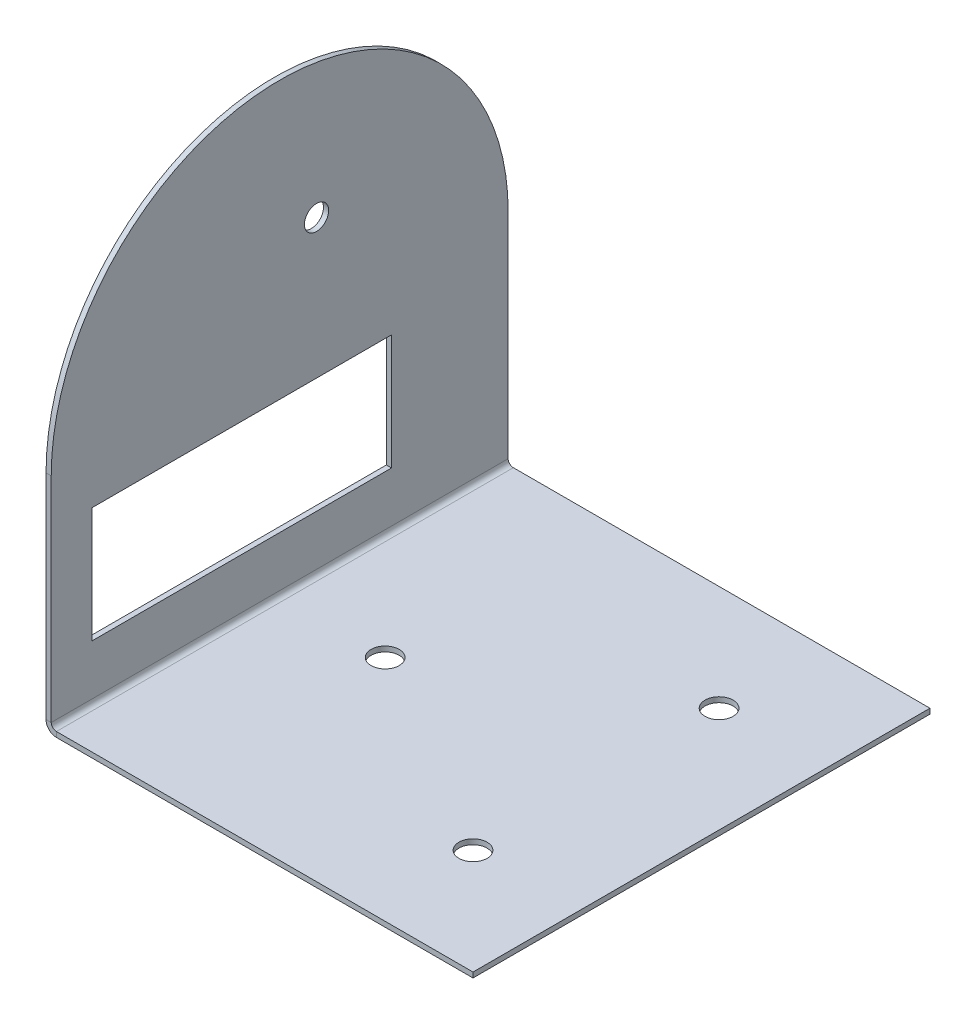
ISO-10303-21;
HEADER;
FILE_DESCRIPTION(('STEP AP214'),'2;1');
FILE_NAME('part.step','',(''),(''),'','','');
FILE_SCHEMA(('AUTOMOTIVE_DESIGN { 1 0 10303 214 1 1 1 1 }'));
ENDSEC;
DATA;
#1=APPLICATION_CONTEXT('core data for automotive mechanical design processes');
#2=APPLICATION_PROTOCOL_DEFINITION('international standard','automotive_design',2000,#1);
#3=PRODUCT_CONTEXT('',#1,'mechanical');
#4=PRODUCT('Part','Part','',(#3));
#5=PRODUCT_RELATED_PRODUCT_CATEGORY('part','',(#4));
#6=PRODUCT_DEFINITION_FORMATION('','',#4);
#7=PRODUCT_DEFINITION_CONTEXT('part definition',#1,'design');
#8=PRODUCT_DEFINITION('design','',#6,#7);
#9=PRODUCT_DEFINITION_SHAPE('','',#8);
#10=(LENGTH_UNIT() NAMED_UNIT(*) SI_UNIT(.MILLI.,.METRE.));
#11=(NAMED_UNIT(*) PLANE_ANGLE_UNIT() SI_UNIT($,.RADIAN.));
#12=(NAMED_UNIT(*) SI_UNIT($,.STERADIAN.) SOLID_ANGLE_UNIT());
#13=UNCERTAINTY_MEASURE_WITH_UNIT(LENGTH_MEASURE(1.E-05),#10,'distance_accuracy_value','');
#14=(GEOMETRIC_REPRESENTATION_CONTEXT(3) GLOBAL_UNCERTAINTY_ASSIGNED_CONTEXT((#13)) GLOBAL_UNIT_ASSIGNED_CONTEXT((#10,
#11,#12)) REPRESENTATION_CONTEXT('',''));
#15=CARTESIAN_POINT('',(0.,0.,0.));
#16=DIRECTION('',(0.,0.,1.));
#17=DIRECTION('',(1.,0.,0.));
#18=AXIS2_PLACEMENT_3D('',#15,#16,#17);
#19=CARTESIAN_POINT('',(-0.0424794644886288,31.1258682095468,32.5));
#20=DIRECTION('',(0.,0.,1.));
#21=DIRECTION('',(0.,-1.,0.));
#22=AXIS2_PLACEMENT_3D('',#19,#20,#21);
#23=PLANE('',#22);
#24=DIRECTION('',(0.,-1.,0.));
#25=VECTOR('',#24,1.);
#26=CARTESIAN_POINT('',(-0.0424794644886288,31.1258682095468,32.5));
#27=LINE('',#26,#25);
#28=CARTESIAN_POINT('',(-0.0424794644886288,31.1258682095468,32.5));
#29=VERTEX_POINT('',#28);
#30=CARTESIAN_POINT('',(-0.0424794644887348,0.736600000000005,32.5));
#31=VERTEX_POINT('',#30);
#32=EDGE_CURVE('E216',#29,#31,#27,.T.);
#33=ORIENTED_EDGE('',*,*,#32,.T.);
#34=DIRECTION('',(1.,0.,0.));
#35=VECTOR('',#34,1.);
#36=CARTESIAN_POINT('',(-0.0424794644887348,0.736600000000005,32.5));
#37=LINE('',#36,#35);
#38=CARTESIAN_POINT('',(0.694120535511267,0.736600000000006,32.5));
#39=VERTEX_POINT('',#38);
#40=EDGE_CURVE('E235',#31,#39,#37,.T.);
#41=ORIENTED_EDGE('',*,*,#40,.T.);
#42=DIRECTION('',(0.,-1.,0.));
#43=VECTOR('',#42,1.);
#44=CARTESIAN_POINT('',(0.694120535511371,31.1258682095468,32.5));
#45=LINE('',#44,#43);
#46=CARTESIAN_POINT('',(0.694120535511371,31.1258682095468,32.5));
#47=VERTEX_POINT('',#46);
#48=EDGE_CURVE('E221',#47,#39,#45,.T.);
#49=ORIENTED_EDGE('',*,*,#48,.F.);
#50=DIRECTION('',(1.,0.,0.));
#51=VECTOR('',#50,1.);
#52=CARTESIAN_POINT('',(-0.0424794644886288,31.1258682095468,32.5));
#53=LINE('',#52,#51);
#54=EDGE_CURVE('E222',#29,#47,#53,.T.);
#55=ORIENTED_EDGE('',*,*,#54,.F.);
#56=EDGE_LOOP('',(#33,#41,#49,#55));
#57=FACE_BOUND('',#56,.T.);
#58=ADVANCED_FACE('F41',(#57),#23,.T.);
#59=CARTESIAN_POINT('',(-0.0424794644886357,31.1258682095468,-32.5));
#60=DIRECTION('',(0.,0.,-1.));
#61=DIRECTION('',(0.,1.,0.));
#62=AXIS2_PLACEMENT_3D('',#59,#60,#61);
#63=PLANE('',#62);
#64=DIRECTION('',(0.,1.,0.));
#65=VECTOR('',#64,1.);
#66=CARTESIAN_POINT('',(0.694120535511364,31.1258682095468,-32.5));
#67=LINE('',#66,#65);
#68=CARTESIAN_POINT('',(0.69412053551126,0.736600000000006,-32.5));
#69=VERTEX_POINT('',#68);
#70=CARTESIAN_POINT('',(0.694120535511364,31.1258682095468,-32.5));
#71=VERTEX_POINT('',#70);
#72=EDGE_CURVE('E140',#69,#71,#67,.T.);
#73=ORIENTED_EDGE('',*,*,#72,.F.);
#74=DIRECTION('',(-1.,0.,0.));
#75=VECTOR('',#74,1.);
#76=CARTESIAN_POINT('',(-0.0424794644887417,0.736600000000005,-32.5));
#77=LINE('',#76,#75);
#78=CARTESIAN_POINT('',(-0.04247946448874,0.736600000000013,-32.5));
#79=VERTEX_POINT('',#78);
#80=EDGE_CURVE('E230',#69,#79,#77,.T.);
#81=ORIENTED_EDGE('',*,*,#80,.T.);
#82=DIRECTION('',(0.,1.,0.));
#83=VECTOR('',#82,1.);
#84=CARTESIAN_POINT('',(-0.0424794644886357,31.1258682095468,-32.5));
#85=LINE('',#84,#83);
#86=CARTESIAN_POINT('',(-0.0424794644886357,31.1258682095468,-32.5));
#87=VERTEX_POINT('',#86);
#88=EDGE_CURVE('E217',#79,#87,#85,.T.);
#89=ORIENTED_EDGE('',*,*,#88,.T.);
#90=DIRECTION('',(1.,0.,0.));
#91=VECTOR('',#90,1.);
#92=CARTESIAN_POINT('',(-0.0424794644886357,31.1258682095468,-32.5));
#93=LINE('',#92,#91);
#94=EDGE_CURVE('E225',#87,#71,#93,.T.);
#95=ORIENTED_EDGE('',*,*,#94,.T.);
#96=EDGE_LOOP('',(#73,#81,#89,#95));
#97=FACE_BOUND('',#96,.T.);
#98=ADVANCED_FACE('F283',(#97),#63,.T.);
#99=CARTESIAN_POINT('',(-0.0424794644886322,31.1258682095468,0.));
#100=DIRECTION('',(-1.,0.,0.));
#101=DIRECTION('',(0.,0.,-1.));
#102=AXIS2_PLACEMENT_3D('',#99,#100,#101);
#103=PLANE('',#102);
#104=CARTESIAN_POINT('',(-0.042479464488588,44.0838038982933,-5.23936924556023));
#105=DIRECTION('',(-1.,0.,0.));
#106=DIRECTION('',(0.,-1.,0.));
#107=AXIS2_PLACEMENT_3D('',#104,#105,#106);
#108=CIRCLE('',#107,1.7249999999959);
#109=CARTESIAN_POINT('',(-0.042479464488594,42.3588038982974,-5.23936924556023));
#110=VERTEX_POINT('',#109);
#111=EDGE_CURVE('E164',#110,#110,#108,.T.);
#112=ORIENTED_EDGE('',*,*,#111,.F.);
#113=EDGE_LOOP('',(#112));
#114=FACE_BOUND('',#113,.T.);
#115=DIRECTION('',(0.,0.,-1.));
#116=VECTOR('',#115,1.);
#117=CARTESIAN_POINT('',(-0.0424794644886561,24.2941252983151,0.));
#118=LINE('',#117,#116);
#119=CARTESIAN_POINT('',(-0.0424794644886817,24.2941252983151,26.667867805827));
#120=VERTEX_POINT('',#119);
#121=CARTESIAN_POINT('',(-0.0424794644886578,24.2941252983152,-15.904978209786));
#122=VERTEX_POINT('',#121);
#123=EDGE_CURVE('E181',#120,#122,#118,.T.);
#124=ORIENTED_EDGE('',*,*,#123,.F.);
#125=DIRECTION('',(0.,1.,0.));
#126=VECTOR('',#125,1.);
#127=CARTESIAN_POINT('',(-0.0424794644886294,31.1258682095468,26.667867805827));
#128=LINE('',#127,#126);
#129=CARTESIAN_POINT('',(-0.0424794644887129,7.89147844340477,26.667867805827));
#130=VERTEX_POINT('',#129);
#131=EDGE_CURVE('E179',#130,#120,#128,.T.);
#132=ORIENTED_EDGE('',*,*,#131,.F.);
#133=DIRECTION('',(0.,0.,1.));
#134=VECTOR('',#133,1.);
#135=CARTESIAN_POINT('',(-0.0424794644887134,7.89147844340476,0.));
#136=LINE('',#135,#134);
#137=CARTESIAN_POINT('',(-0.0424794644886851,7.89147844340476,-15.904978209786));
#138=VERTEX_POINT('',#137);
#139=EDGE_CURVE('E177',#138,#130,#136,.T.);
#140=ORIENTED_EDGE('',*,*,#139,.F.);
#141=DIRECTION('',(0.,-1.,0.));
#142=VECTOR('',#141,1.);
#143=CARTESIAN_POINT('',(-0.0424794644886339,31.1258682095468,-15.904978209786));
#144=LINE('',#143,#142);
#145=EDGE_CURVE('E170',#122,#138,#144,.T.);
#146=ORIENTED_EDGE('',*,*,#145,.F.);
#147=EDGE_LOOP('',(#124,#132,#140,#146));
#148=FACE_BOUND('',#147,.T.);
#149=ORIENTED_EDGE('',*,*,#88,.F.);
#150=DIRECTION('',(0.,0.,1.));
#151=VECTOR('',#150,1.);
#152=CARTESIAN_POINT('',(-0.0424794644887383,0.736600000000005,0.));
#153=LINE('',#152,#151);
#154=EDGE_CURVE('E224',#79,#31,#153,.T.);
#155=ORIENTED_EDGE('',*,*,#154,.T.);
#156=ORIENTED_EDGE('',*,*,#32,.F.);
#157=CARTESIAN_POINT('',(-0.0424794644886322,31.1258682095468,0.));
#158=DIRECTION('',(1.,0.,0.));
#159=DIRECTION('',(0.,0.,-1.));
#160=AXIS2_PLACEMENT_3D('',#157,#158,#159);
#161=CIRCLE('',#160,32.5);
#162=EDGE_CURVE('E213',#87,#29,#161,.T.);
#163=ORIENTED_EDGE('',*,*,#162,.F.);
#164=EDGE_LOOP('',(#149,#155,#156,#163));
#165=FACE_BOUND('',#164,.T.);
#166=ADVANCED_FACE('F265',(#114,#148,#165),#103,.T.);
#167=CARTESIAN_POINT('',(-0.0424794644886322,31.1258682095468,0.));
#168=DIRECTION('',(1.,0.,0.));
#169=DIRECTION('',(0.,0.,1.));
#170=AXIS2_PLACEMENT_3D('',#167,#168,#169);
#171=CYLINDRICAL_SURFACE('',#170,32.5);
#172=CARTESIAN_POINT('',(0.694120535511368,31.1258682095468,0.));
#173=DIRECTION('',(1.,0.,0.));
#174=DIRECTION('',(0.,0.,-1.));
#175=AXIS2_PLACEMENT_3D('',#172,#173,#174);
#176=CIRCLE('',#175,32.5);
#177=EDGE_CURVE('E218',#71,#47,#176,.T.);
#178=ORIENTED_EDGE('',*,*,#177,.F.);
#179=ORIENTED_EDGE('',*,*,#94,.F.);
#180=ORIENTED_EDGE('',*,*,#162,.T.);
#181=ORIENTED_EDGE('',*,*,#54,.T.);
#182=EDGE_LOOP('',(#178,#179,#180,#181));
#183=FACE_BOUND('',#182,.T.);
#184=ADVANCED_FACE('F316',(#183),#171,.T.);
#185=CARTESIAN_POINT('',(0.694120535511368,31.1258682095468,0.));
#186=DIRECTION('',(-1.,0.,0.));
#187=DIRECTION('',(0.,0.,-1.));
#188=AXIS2_PLACEMENT_3D('',#185,#186,#187);
#189=PLANE('',#188);
#190=CARTESIAN_POINT('',(0.694120535511412,44.0838038982933,-5.23936924556023));
#191=DIRECTION('',(-1.,0.,0.));
#192=DIRECTION('',(0.,-1.,0.));
#193=AXIS2_PLACEMENT_3D('',#190,#191,#192);
#194=CIRCLE('',#193,1.7249999999959);
#195=CARTESIAN_POINT('',(0.694120535511406,42.3588038982974,-5.23936924556023));
#196=VERTEX_POINT('',#195);
#197=EDGE_CURVE('E44',#196,#196,#194,.T.);
#198=ORIENTED_EDGE('',*,*,#197,.T.);
#199=EDGE_LOOP('',(#198));
#200=FACE_BOUND('',#199,.T.);
#201=DIRECTION('',(0.,1.,0.));
#202=VECTOR('',#201,1.);
#203=CARTESIAN_POINT('',(0.694120535511371,31.1258682095468,26.667867805827));
#204=LINE('',#203,#202);
#205=CARTESIAN_POINT('',(0.694120535511288,7.89147844340477,26.667867805827));
#206=VERTEX_POINT('',#205);
#207=CARTESIAN_POINT('',(0.694120535511319,24.2941252983151,26.667867805827));
#208=VERTEX_POINT('',#207);
#209=EDGE_CURVE('E49',#206,#208,#204,.T.);
#210=ORIENTED_EDGE('',*,*,#209,.T.);
#211=DIRECTION('',(0.,0.,-1.));
#212=VECTOR('',#211,1.);
#213=CARTESIAN_POINT('',(0.694120535511344,24.2941252983151,0.));
#214=LINE('',#213,#212);
#215=CARTESIAN_POINT('',(0.694120535511315,24.2941252983151,-15.904978209786));
#216=VERTEX_POINT('',#215);
#217=EDGE_CURVE('E12',#208,#216,#214,.T.);
#218=ORIENTED_EDGE('',*,*,#217,.T.);
#219=DIRECTION('',(0.,-1.,0.));
#220=VECTOR('',#219,1.);
#221=CARTESIAN_POINT('',(0.694120535511366,31.1258682095468,-15.904978209786));
#222=LINE('',#221,#220);
#223=CARTESIAN_POINT('',(0.694120535511285,7.89147844340473,-15.904978209786));
#224=VERTEX_POINT('',#223);
#225=EDGE_CURVE('E238',#216,#224,#222,.T.);
#226=ORIENTED_EDGE('',*,*,#225,.T.);
#227=DIRECTION('',(0.,0.,1.));
#228=VECTOR('',#227,1.);
#229=CARTESIAN_POINT('',(0.694120535511287,7.89147844340476,0.));
#230=LINE('',#229,#228);
#231=EDGE_CURVE('E247',#224,#206,#230,.T.);
#232=ORIENTED_EDGE('',*,*,#231,.T.);
#233=EDGE_LOOP('',(#210,#218,#226,#232));
#234=FACE_BOUND('',#233,.T.);
#235=DIRECTION('',(0.,0.,1.));
#236=VECTOR('',#235,1.);
#237=CARTESIAN_POINT('',(0.694120535511262,0.736600000000003,0.));
#238=LINE('',#237,#236);
#239=EDGE_CURVE('E233',#69,#39,#238,.T.);
#240=ORIENTED_EDGE('',*,*,#239,.F.);
#241=ORIENTED_EDGE('',*,*,#72,.T.);
#242=ORIENTED_EDGE('',*,*,#177,.T.);
#243=ORIENTED_EDGE('',*,*,#48,.T.);
#244=EDGE_LOOP('',(#240,#241,#242,#243));
#245=FACE_BOUND('',#244,.T.);
#246=ADVANCED_FACE('F252',(#200,#234,#245),#189,.F.);
#247=CARTESIAN_POINT('',(15.6941205355112,-0.7366,0.));
#248=DIRECTION('',(0.,1.,0.));
#249=DIRECTION('',(0.,0.,1.));
#250=AXIS2_PLACEMENT_3D('',#247,#248,#249);
#251=CYLINDRICAL_SURFACE('',#250,2.);
#252=CARTESIAN_POINT('',(15.6941205355112,-0.7366,0.));
#253=DIRECTION('',(0.,1.,0.));
#254=DIRECTION('',(0.,0.,1.));
#255=AXIS2_PLACEMENT_3D('',#252,#253,#254);
#256=CIRCLE('',#255,2.);
#257=CARTESIAN_POINT('',(15.6941205355112,-0.7366,2.));
#258=VERTEX_POINT('',#257);
#259=EDGE_CURVE('E202',#258,#258,#256,.T.);
#260=ORIENTED_EDGE('',*,*,#259,.F.);
#261=EDGE_LOOP('',(#260));
#262=FACE_BOUND('',#261,.T.);
#263=CARTESIAN_POINT('',(15.6941205355112,0.,0.));
#264=DIRECTION('',(0.,1.,0.));
#265=DIRECTION('',(0.,0.,1.));
#266=AXIS2_PLACEMENT_3D('',#263,#264,#265);
#267=CIRCLE('',#266,2.);
#268=CARTESIAN_POINT('',(15.6941205355112,0.,2.));
#269=VERTEX_POINT('',#268);
#270=EDGE_CURVE('E205',#269,#269,#267,.T.);
#271=ORIENTED_EDGE('',*,*,#270,.T.);
#272=EDGE_LOOP('',(#271));
#273=FACE_BOUND('',#272,.T.);
#274=ADVANCED_FACE('F323',(#262,#273),#251,.F.);
#275=CARTESIAN_POINT('',(-30.6941205355112,-0.7366,0.));
#276=DIRECTION('',(0.,-1.,0.));
#277=DIRECTION('',(0.,0.,-1.));
#278=AXIS2_PLACEMENT_3D('',#275,#276,#277);
#279=PLANE('',#278);
#280=DIRECTION('',(0.,0.,1.));
#281=VECTOR('',#280,1.);
#282=CARTESIAN_POINT('',(1.43072053551126,-0.7366,0.));
#283=LINE('',#282,#281);
#284=CARTESIAN_POINT('',(1.43072053551126,-0.7366,-32.5));
#285=VERTEX_POINT('',#284);
#286=CARTESIAN_POINT('',(1.43072053551126,-0.7366,32.5));
#287=VERTEX_POINT('',#286);
#288=EDGE_CURVE('E190',#285,#287,#283,.T.);
#289=ORIENTED_EDGE('',*,*,#288,.F.);
#290=DIRECTION('',(-1.,0.,0.));
#291=VECTOR('',#290,1.);
#292=CARTESIAN_POINT('',(-30.6941205355112,-0.7366,-32.5));
#293=LINE('',#292,#291);
#294=CARTESIAN_POINT('',(60.6941205355112,-0.7366,-32.5));
#295=VERTEX_POINT('',#294);
#296=EDGE_CURVE('E154',#295,#285,#293,.T.);
#297=ORIENTED_EDGE('',*,*,#296,.F.);
#298=DIRECTION('',(0.,0.,-1.));
#299=VECTOR('',#298,1.);
#300=CARTESIAN_POINT('',(60.6941205355112,-0.7366,32.5));
#301=LINE('',#300,#299);
#302=CARTESIAN_POINT('',(60.6941205355112,-0.7366,32.5));
#303=VERTEX_POINT('',#302);
#304=EDGE_CURVE('E147',#303,#295,#301,.T.);
#305=ORIENTED_EDGE('',*,*,#304,.F.);
#306=DIRECTION('',(1.,0.,0.));
#307=VECTOR('',#306,1.);
#308=CARTESIAN_POINT('',(-30.6941205355112,-0.7366,32.5));
#309=LINE('',#308,#307);
#310=EDGE_CURVE('E129',#287,#303,#309,.T.);
#311=ORIENTED_EDGE('',*,*,#310,.F.);
#312=EDGE_LOOP('',(#289,#297,#305,#311));
#313=FACE_BOUND('',#312,.T.);
#314=ORIENTED_EDGE('',*,*,#259,.T.);
#315=EDGE_LOOP('',(#314));
#316=FACE_BOUND('',#315,.T.);
#317=CARTESIAN_POINT('',(45.6941205355112,-0.7366,-17.5));
#318=DIRECTION('',(0.,1.,0.));
#319=DIRECTION('',(0.,0.,1.));
#320=AXIS2_PLACEMENT_3D('',#317,#318,#319);
#321=CIRCLE('',#320,2.);
#322=CARTESIAN_POINT('',(45.6941205355112,-0.7366,-15.5));
#323=VERTEX_POINT('',#322);
#324=EDGE_CURVE('E537',#323,#323,#321,.T.);
#325=ORIENTED_EDGE('',*,*,#324,.T.);
#326=EDGE_LOOP('',(#325));
#327=FACE_BOUND('',#326,.T.);
#328=CARTESIAN_POINT('',(45.6941205355112,-0.7366,17.5));
#329=DIRECTION('',(0.,1.,0.));
#330=DIRECTION('',(0.,0.,1.));
#331=AXIS2_PLACEMENT_3D('',#328,#329,#330);
#332=CIRCLE('',#331,2.);
#333=CARTESIAN_POINT('',(45.6941205355112,-0.7366,19.5));
#334=VERTEX_POINT('',#333);
#335=EDGE_CURVE('E157',#334,#334,#332,.T.);
#336=ORIENTED_EDGE('',*,*,#335,.T.);
#337=EDGE_LOOP('',(#336));
#338=FACE_BOUND('',#337,.T.);
#339=ADVANCED_FACE('F152',(#313,#316,#327,#338),#279,.T.);
#340=CARTESIAN_POINT('',(-30.6941205355112,-0.7366,-32.5));
#341=DIRECTION('',(0.,0.,-1.));
#342=DIRECTION('',(-1.,0.,0.));
#343=AXIS2_PLACEMENT_3D('',#340,#341,#342);
#344=PLANE('',#343);
#345=DIRECTION('',(0.,-1.,0.));
#346=VECTOR('',#345,1.);
#347=CARTESIAN_POINT('',(1.43072053551126,-0.7366,-32.5));
#348=LINE('',#347,#346);
#349=CARTESIAN_POINT('',(1.43072053551126,0.,-32.5));
#350=VERTEX_POINT('',#349);
#351=EDGE_CURVE('E208',#350,#285,#348,.T.);
#352=ORIENTED_EDGE('',*,*,#351,.F.);
#353=DIRECTION('',(-1.,0.,0.));
#354=VECTOR('',#353,1.);
#355=CARTESIAN_POINT('',(-30.6941205355112,0.,-32.5));
#356=LINE('',#355,#354);
#357=CARTESIAN_POINT('',(60.6941205355112,0.,-32.5));
#358=VERTEX_POINT('',#357);
#359=EDGE_CURVE('E199',#358,#350,#356,.T.);
#360=ORIENTED_EDGE('',*,*,#359,.F.);
#361=DIRECTION('',(0.,1.,0.));
#362=VECTOR('',#361,1.);
#363=CARTESIAN_POINT('',(60.6941205355112,-0.7366,-32.5));
#364=LINE('',#363,#362);
#365=EDGE_CURVE('E150',#295,#358,#364,.T.);
#366=ORIENTED_EDGE('',*,*,#365,.F.);
#367=ORIENTED_EDGE('',*,*,#296,.T.);
#368=EDGE_LOOP('',(#352,#360,#366,#367));
#369=FACE_BOUND('',#368,.T.);
#370=ADVANCED_FACE('F304',(#369),#344,.T.);
#371=CARTESIAN_POINT('',(-30.6941205355112,0.,0.));
#372=DIRECTION('',(0.,-1.,0.));
#373=DIRECTION('',(0.,0.,-1.));
#374=AXIS2_PLACEMENT_3D('',#371,#372,#373);
#375=PLANE('',#374);
#376=ORIENTED_EDGE('',*,*,#270,.F.);
#377=EDGE_LOOP('',(#376));
#378=FACE_BOUND('',#377,.T.);
#379=ORIENTED_EDGE('',*,*,#359,.T.);
#380=DIRECTION('',(0.,0.,1.));
#381=VECTOR('',#380,1.);
#382=CARTESIAN_POINT('',(1.43072053551126,0.,0.));
#383=LINE('',#382,#381);
#384=CARTESIAN_POINT('',(1.43072053551126,0.,32.5));
#385=VERTEX_POINT('',#384);
#386=EDGE_CURVE('E196',#350,#385,#383,.T.);
#387=ORIENTED_EDGE('',*,*,#386,.T.);
#388=DIRECTION('',(1.,0.,0.));
#389=VECTOR('',#388,1.);
#390=CARTESIAN_POINT('',(-30.6941205355112,0.,32.5));
#391=LINE('',#390,#389);
#392=CARTESIAN_POINT('',(60.6941205355112,0.,32.5));
#393=VERTEX_POINT('',#392);
#394=EDGE_CURVE('E141',#385,#393,#391,.T.);
#395=ORIENTED_EDGE('',*,*,#394,.T.);
#396=DIRECTION('',(0.,0.,-1.));
#397=VECTOR('',#396,1.);
#398=CARTESIAN_POINT('',(60.6941205355112,0.,32.5));
#399=LINE('',#398,#397);
#400=EDGE_CURVE('E149',#393,#358,#399,.T.);
#401=ORIENTED_EDGE('',*,*,#400,.T.);
#402=EDGE_LOOP('',(#379,#387,#395,#401));
#403=FACE_BOUND('',#402,.T.);
#404=CARTESIAN_POINT('',(45.6941205355112,0.,-17.5));
#405=DIRECTION('',(0.,1.,0.));
#406=DIRECTION('',(0.,0.,1.));
#407=AXIS2_PLACEMENT_3D('',#404,#405,#406);
#408=CIRCLE('',#407,2.);
#409=CARTESIAN_POINT('',(45.6941205355112,0.,-15.5));
#410=VERTEX_POINT('',#409);
#411=EDGE_CURVE('E540',#410,#410,#408,.T.);
#412=ORIENTED_EDGE('',*,*,#411,.F.);
#413=EDGE_LOOP('',(#412));
#414=FACE_BOUND('',#413,.T.);
#415=CARTESIAN_POINT('',(45.6941205355112,0.,17.5));
#416=DIRECTION('',(0.,1.,0.));
#417=DIRECTION('',(0.,0.,1.));
#418=AXIS2_PLACEMENT_3D('',#415,#416,#417);
#419=CIRCLE('',#418,2.);
#420=CARTESIAN_POINT('',(45.6941205355112,0.,19.5));
#421=VERTEX_POINT('',#420);
#422=EDGE_CURVE('E160',#421,#421,#419,.T.);
#423=ORIENTED_EDGE('',*,*,#422,.F.);
#424=EDGE_LOOP('',(#423));
#425=FACE_BOUND('',#424,.T.);
#426=ADVANCED_FACE('F308',(#378,#403,#414,#425),#375,.F.);
#427=CARTESIAN_POINT('',(-30.6941205355112,-0.7366,32.5));
#428=DIRECTION('',(0.,0.,1.));
#429=DIRECTION('',(1.,0.,0.));
#430=AXIS2_PLACEMENT_3D('',#427,#428,#429);
#431=PLANE('',#430);
#432=DIRECTION('',(0.,1.,0.));
#433=VECTOR('',#432,1.);
#434=CARTESIAN_POINT('',(1.43072053551126,-0.7366,32.5));
#435=LINE('',#434,#433);
#436=EDGE_CURVE('E135',#287,#385,#435,.T.);
#437=ORIENTED_EDGE('',*,*,#436,.F.);
#438=ORIENTED_EDGE('',*,*,#310,.T.);
#439=DIRECTION('',(0.,1.,0.));
#440=VECTOR('',#439,1.);
#441=CARTESIAN_POINT('',(60.6941205355112,-0.7366,32.5));
#442=LINE('',#441,#440);
#443=EDGE_CURVE('E132',#303,#393,#442,.T.);
#444=ORIENTED_EDGE('',*,*,#443,.T.);
#445=ORIENTED_EDGE('',*,*,#394,.F.);
#446=EDGE_LOOP('',(#437,#438,#444,#445));
#447=FACE_BOUND('',#446,.T.);
#448=ADVANCED_FACE('F131',(#447),#431,.T.);
#449=CARTESIAN_POINT('',(1.43072053551126,0.7366,-32.5));
#450=DIRECTION('',(0.,0.,-1.));
#451=DIRECTION('',(-1.,0.,0.));
#452=AXIS2_PLACEMENT_3D('',#449,#450,#451);
#453=PLANE('',#452);
#454=ORIENTED_EDGE('',*,*,#80,.F.);
#455=CARTESIAN_POINT('',(1.43072053551126,0.7366,-32.5));
#456=DIRECTION('',(0.,0.,-1.));
#457=DIRECTION('',(-1.,0.,0.));
#458=AXIS2_PLACEMENT_3D('',#455,#456,#457);
#459=CIRCLE('',#458,0.7366);
#460=EDGE_CURVE('E183',#69,#350,#459,.F.);
#461=ORIENTED_EDGE('',*,*,#460,.T.);
#462=ORIENTED_EDGE('',*,*,#351,.T.);
#463=CARTESIAN_POINT('',(1.43072053551126,0.7366,-32.5));
#464=DIRECTION('',(0.,0.,1.));
#465=DIRECTION('',(-1.,0.,0.));
#466=AXIS2_PLACEMENT_3D('',#463,#464,#465);
#467=CIRCLE('',#466,1.4732);
#468=EDGE_CURVE('E184',#79,#285,#467,.T.);
#469=ORIENTED_EDGE('',*,*,#468,.F.);
#470=EDGE_LOOP('',(#454,#461,#462,#469));
#471=FACE_BOUND('',#470,.T.);
#472=ADVANCED_FACE('F299',(#471),#453,.T.);
#473=CARTESIAN_POINT('',(1.43072053551127,0.7366,32.5));
#474=DIRECTION('',(0.,0.,1.));
#475=DIRECTION('',(1.,0.,0.));
#476=AXIS2_PLACEMENT_3D('',#473,#474,#475);
#477=PLANE('',#476);
#478=CARTESIAN_POINT('',(1.43072053551127,0.7366,32.5));
#479=DIRECTION('',(0.,0.,-1.));
#480=DIRECTION('',(-1.,0.,0.));
#481=AXIS2_PLACEMENT_3D('',#478,#479,#480);
#482=CIRCLE('',#481,0.7366);
#483=EDGE_CURVE('E188',#385,#39,#482,.T.);
#484=ORIENTED_EDGE('',*,*,#483,.T.);
#485=ORIENTED_EDGE('',*,*,#40,.F.);
#486=CARTESIAN_POINT('',(1.43072053551127,0.7366,32.5));
#487=DIRECTION('',(0.,0.,-1.));
#488=DIRECTION('',(1.,0.,0.));
#489=AXIS2_PLACEMENT_3D('',#486,#487,#488);
#490=CIRCLE('',#489,1.4732);
#491=EDGE_CURVE('E187',#287,#31,#490,.T.);
#492=ORIENTED_EDGE('',*,*,#491,.F.);
#493=ORIENTED_EDGE('',*,*,#436,.T.);
#494=EDGE_LOOP('',(#484,#485,#492,#493));
#495=FACE_BOUND('',#494,.T.);
#496=ADVANCED_FACE('F311',(#495),#477,.T.);
#497=CARTESIAN_POINT('',(1.43072053551127,0.7366,65.0273388100535));
#498=DIRECTION('',(0.,0.,-1.));
#499=DIRECTION('',(-1.,0.,0.));
#500=AXIS2_PLACEMENT_3D('',#497,#498,#499);
#501=CYLINDRICAL_SURFACE('',#500,1.4732);
#502=ORIENTED_EDGE('',*,*,#288,.T.);
#503=ORIENTED_EDGE('',*,*,#491,.T.);
#504=ORIENTED_EDGE('',*,*,#154,.F.);
#505=ORIENTED_EDGE('',*,*,#468,.T.);
#506=EDGE_LOOP('',(#502,#503,#504,#505));
#507=FACE_BOUND('',#506,.T.);
#508=ADVANCED_FACE('F277',(#507),#501,.T.);
#509=CARTESIAN_POINT('',(1.43072053551127,0.7366,65.0273388100535));
#510=DIRECTION('',(0.,0.,-1.));
#511=DIRECTION('',(-1.,0.,0.));
#512=AXIS2_PLACEMENT_3D('',#509,#510,#511);
#513=CYLINDRICAL_SURFACE('',#512,0.7366);
#514=ORIENTED_EDGE('',*,*,#386,.F.);
#515=ORIENTED_EDGE('',*,*,#460,.F.);
#516=ORIENTED_EDGE('',*,*,#239,.T.);
#517=ORIENTED_EDGE('',*,*,#483,.F.);
#518=EDGE_LOOP('',(#514,#515,#516,#517));
#519=FACE_BOUND('',#518,.T.);
#520=ADVANCED_FACE('F270',(#519),#513,.F.);
#521=CARTESIAN_POINT('',(30.6941205355114,24.2941252983152,26.667867805827));
#522=DIRECTION('',(0.,1.,0.));
#523=DIRECTION('',(-1.,0.,0.));
#524=AXIS2_PLACEMENT_3D('',#521,#522,#523);
#525=PLANE('',#524);
#526=ORIENTED_EDGE('',*,*,#123,.T.);
#527=DIRECTION('',(-1.,0.,0.));
#528=VECTOR('',#527,1.);
#529=CARTESIAN_POINT('',(30.6941205355114,24.2941252983152,-15.904978209786));
#530=LINE('',#529,#528);
#531=EDGE_CURVE('E56',#216,#122,#530,.T.);
#532=ORIENTED_EDGE('',*,*,#531,.F.);
#533=ORIENTED_EDGE('',*,*,#217,.F.);
#534=DIRECTION('',(-1.,0.,0.));
#535=VECTOR('',#534,1.);
#536=CARTESIAN_POINT('',(30.6941205355114,24.2941252983152,26.667867805827));
#537=LINE('',#536,#535);
#538=EDGE_CURVE('E167',#208,#120,#537,.T.);
#539=ORIENTED_EDGE('',*,*,#538,.T.);
#540=EDGE_LOOP('',(#526,#532,#533,#539));
#541=FACE_BOUND('',#540,.T.);
#542=ADVANCED_FACE('F268',(#541),#525,.F.);
#543=CARTESIAN_POINT('',(30.6941205355114,24.2941252983152,26.667867805827));
#544=DIRECTION('',(0.,0.,1.));
#545=DIRECTION('',(1.,0.,0.));
#546=AXIS2_PLACEMENT_3D('',#543,#544,#545);
#547=PLANE('',#546);
#548=ORIENTED_EDGE('',*,*,#131,.T.);
#549=ORIENTED_EDGE('',*,*,#538,.F.);
#550=ORIENTED_EDGE('',*,*,#209,.F.);
#551=DIRECTION('',(-1.,0.,0.));
#552=VECTOR('',#551,1.);
#553=CARTESIAN_POINT('',(30.6941205355115,7.89147844340488,26.667867805827));
#554=LINE('',#553,#552);
#555=EDGE_CURVE('E171',#206,#130,#554,.T.);
#556=ORIENTED_EDGE('',*,*,#555,.T.);
#557=EDGE_LOOP('',(#548,#549,#550,#556));
#558=FACE_BOUND('',#557,.T.);
#559=ADVANCED_FACE('F257',(#558),#547,.F.);
#560=CARTESIAN_POINT('',(30.6941205355115,7.89147844340488,26.667867805827));
#561=DIRECTION('',(0.,-1.,0.));
#562=DIRECTION('',(1.,0.,0.));
#563=AXIS2_PLACEMENT_3D('',#560,#561,#562);
#564=PLANE('',#563);
#565=ORIENTED_EDGE('',*,*,#139,.T.);
#566=ORIENTED_EDGE('',*,*,#555,.F.);
#567=ORIENTED_EDGE('',*,*,#231,.F.);
#568=DIRECTION('',(-1.,0.,0.));
#569=VECTOR('',#568,1.);
#570=CARTESIAN_POINT('',(30.6941205355115,7.89147844340487,-15.904978209786));
#571=LINE('',#570,#569);
#572=EDGE_CURVE('E61',#224,#138,#571,.T.);
#573=ORIENTED_EDGE('',*,*,#572,.T.);
#574=EDGE_LOOP('',(#565,#566,#567,#573));
#575=FACE_BOUND('',#574,.T.);
#576=ADVANCED_FACE('F260',(#575),#564,.F.);
#577=CARTESIAN_POINT('',(30.6941205355114,24.2941252983152,-15.904978209786));
#578=DIRECTION('',(0.,0.,-1.));
#579=DIRECTION('',(0.,1.,0.));
#580=AXIS2_PLACEMENT_3D('',#577,#578,#579);
#581=PLANE('',#580);
#582=ORIENTED_EDGE('',*,*,#145,.T.);
#583=ORIENTED_EDGE('',*,*,#572,.F.);
#584=ORIENTED_EDGE('',*,*,#225,.F.);
#585=ORIENTED_EDGE('',*,*,#531,.T.);
#586=EDGE_LOOP('',(#582,#583,#584,#585));
#587=FACE_BOUND('',#586,.T.);
#588=ADVANCED_FACE('F372',(#587),#581,.F.);
#589=CARTESIAN_POINT('',(30.6941205355113,44.0838038982934,-5.23936924556023));
#590=DIRECTION('',(-1.,0.,0.));
#591=DIRECTION('',(0.,-1.,0.));
#592=AXIS2_PLACEMENT_3D('',#589,#590,#591);
#593=CYLINDRICAL_SURFACE('',#592,1.7249999999959);
#594=ORIENTED_EDGE('',*,*,#111,.T.);
#595=EDGE_LOOP('',(#594));
#596=FACE_BOUND('',#595,.T.);
#597=ORIENTED_EDGE('',*,*,#197,.F.);
#598=EDGE_LOOP('',(#597));
#599=FACE_BOUND('',#598,.T.);
#600=ADVANCED_FACE('F381',(#596,#599),#593,.F.);
#601=CARTESIAN_POINT('',(60.6941205355112,-0.7366,32.5));
#602=DIRECTION('',(1.,0.,0.));
#603=DIRECTION('',(0.,0.,-1.));
#604=AXIS2_PLACEMENT_3D('',#601,#602,#603);
#605=PLANE('',#604);
#606=ORIENTED_EDGE('',*,*,#400,.F.);
#607=ORIENTED_EDGE('',*,*,#443,.F.);
#608=ORIENTED_EDGE('',*,*,#304,.T.);
#609=ORIENTED_EDGE('',*,*,#365,.T.);
#610=EDGE_LOOP('',(#606,#607,#608,#609));
#611=FACE_BOUND('',#610,.T.);
#612=ADVANCED_FACE('F145',(#611),#605,.T.);
#613=CARTESIAN_POINT('',(45.6941205355112,-0.7366,17.5));
#614=DIRECTION('',(0.,1.,0.));
#615=DIRECTION('',(0.,0.,1.));
#616=AXIS2_PLACEMENT_3D('',#613,#614,#615);
#617=CYLINDRICAL_SURFACE('',#616,2.);
#618=ORIENTED_EDGE('',*,*,#335,.F.);
#619=EDGE_LOOP('',(#618));
#620=FACE_BOUND('',#619,.T.);
#621=ORIENTED_EDGE('',*,*,#422,.T.);
#622=EDGE_LOOP('',(#621));
#623=FACE_BOUND('',#622,.T.);
#624=ADVANCED_FACE('F441',(#620,#623),#617,.F.);
#625=CARTESIAN_POINT('',(45.6941205355112,-0.7366,-17.5));
#626=DIRECTION('',(0.,1.,0.));
#627=DIRECTION('',(0.,0.,1.));
#628=AXIS2_PLACEMENT_3D('',#625,#626,#627);
#629=CYLINDRICAL_SURFACE('',#628,2.);
#630=ORIENTED_EDGE('',*,*,#324,.F.);
#631=EDGE_LOOP('',(#630));
#632=FACE_BOUND('',#631,.T.);
#633=ORIENTED_EDGE('',*,*,#411,.T.);
#634=EDGE_LOOP('',(#633));
#635=FACE_BOUND('',#634,.T.);
#636=ADVANCED_FACE('F451',(#632,#635),#629,.F.);
#637=CLOSED_SHELL('',(#58,#98,#166,#184,#246,#274,#339,#370,#426,#448,#472,#496,#508,#520,#542,
#559,#576,#588,#600,#612,#624,#636));
#638=MANIFOLD_SOLID_BREP('B2',#637);
#639=ADVANCED_BREP_SHAPE_REPRESENTATION('',(#18,#638),#14);
#640=SHAPE_DEFINITION_REPRESENTATION(#9,#639);
ENDSEC;
END-ISO-10303-21;
